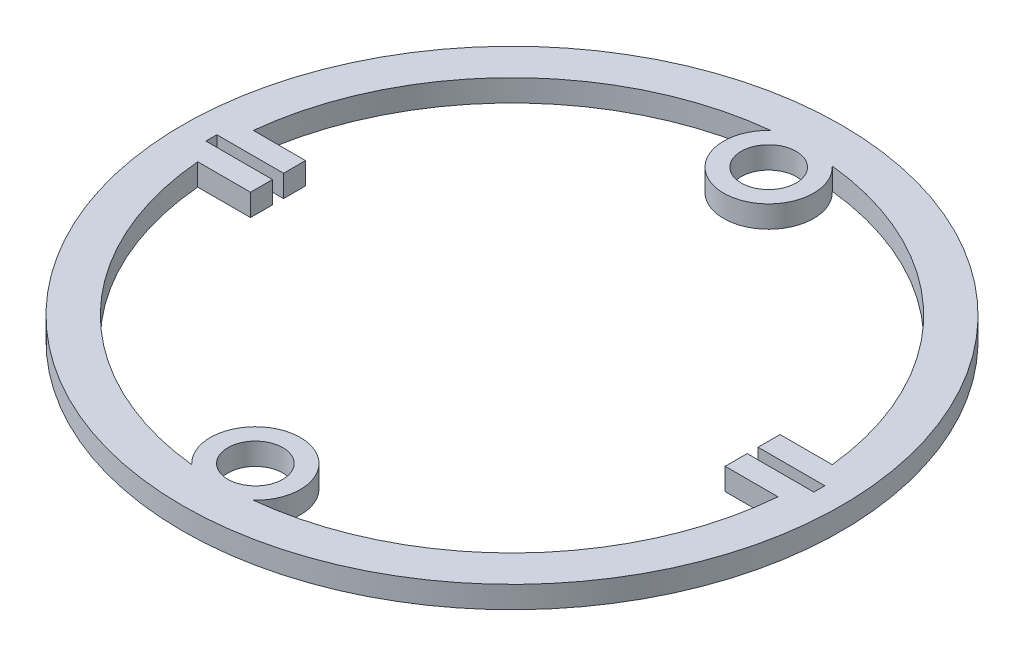
ISO-10303-21;
HEADER;
FILE_DESCRIPTION(('STEP AP214'),'2;1');
FILE_NAME('part.step','',(''),(''),'','','');
FILE_SCHEMA(('AUTOMOTIVE_DESIGN { 1 0 10303 214 1 1 1 1 }'));
ENDSEC;
DATA;
#1=APPLICATION_CONTEXT('core data for automotive mechanical design processes');
#2=APPLICATION_PROTOCOL_DEFINITION('international standard','automotive_design',2000,#1);
#3=PRODUCT_CONTEXT('',#1,'mechanical');
#4=PRODUCT('Part','Part','',(#3));
#5=PRODUCT_RELATED_PRODUCT_CATEGORY('part','',(#4));
#6=PRODUCT_DEFINITION_FORMATION('','',#4);
#7=PRODUCT_DEFINITION_CONTEXT('part definition',#1,'design');
#8=PRODUCT_DEFINITION('design','',#6,#7);
#9=PRODUCT_DEFINITION_SHAPE('','',#8);
#10=(LENGTH_UNIT() NAMED_UNIT(*) SI_UNIT(.MILLI.,.METRE.));
#11=(NAMED_UNIT(*) PLANE_ANGLE_UNIT() SI_UNIT($,.RADIAN.));
#12=(NAMED_UNIT(*) SI_UNIT($,.STERADIAN.) SOLID_ANGLE_UNIT());
#13=UNCERTAINTY_MEASURE_WITH_UNIT(LENGTH_MEASURE(1.E-05),#10,'distance_accuracy_value','');
#14=(GEOMETRIC_REPRESENTATION_CONTEXT(3) GLOBAL_UNCERTAINTY_ASSIGNED_CONTEXT((#13)) GLOBAL_UNIT_ASSIGNED_CONTEXT((#10,
#11,#12)) REPRESENTATION_CONTEXT('',''));
#15=CARTESIAN_POINT('',(0.,0.,0.));
#16=DIRECTION('',(0.,0.,1.));
#17=DIRECTION('',(1.,0.,0.));
#18=AXIS2_PLACEMENT_3D('',#15,#16,#17);
#19=CARTESIAN_POINT('',(0.,50.8,0.));
#20=DIRECTION('',(0.,-1.,0.));
#21=DIRECTION('',(0.,0.,-1.));
#22=AXIS2_PLACEMENT_3D('',#19,#20,#21);
#23=CYLINDRICAL_SURFACE('',#22,33.655);
#24=DIRECTION('',(0.,-1.,0.));
#25=VECTOR('',#24,1.);
#26=CARTESIAN_POINT('',(-33.5390282357704,50.8,2.79152467304071));
#27=LINE('',#26,#25);
#28=CARTESIAN_POINT('',(-33.5390282357704,2.54,2.79152467304071));
#29=VERTEX_POINT('',#28);
#30=CARTESIAN_POINT('',(-33.5390282357704,0.,2.79152467304071));
#31=VERTEX_POINT('',#30);
#32=EDGE_CURVE('E186',#29,#31,#27,.T.);
#33=ORIENTED_EDGE('',*,*,#32,.F.);
#34=CARTESIAN_POINT('',(0.,2.54,0.));
#35=DIRECTION('',(0.,1.,0.));
#36=DIRECTION('',(0.,0.,1.));
#37=AXIS2_PLACEMENT_3D('',#34,#35,#36);
#38=CIRCLE('',#37,33.655);
#39=CARTESIAN_POINT('',(-3.56514678961038,2.54,33.4656354096038));
#40=VERTEX_POINT('',#39);
#41=EDGE_CURVE('E176',#29,#40,#38,.T.);
#42=ORIENTED_EDGE('',*,*,#41,.T.);
#43=DIRECTION('',(0.,-1.,0.));
#44=VECTOR('',#43,1.);
#45=CARTESIAN_POINT('',(-3.56514678961037,50.8,33.4656354096039));
#46=LINE('',#45,#44);
#47=CARTESIAN_POINT('',(-3.56514678961039,0.,33.4656354096038));
#48=VERTEX_POINT('',#47);
#49=EDGE_CURVE('E184',#48,#40,#46,.F.);
#50=ORIENTED_EDGE('',*,*,#49,.F.);
#51=CARTESIAN_POINT('',(0.,0.,0.));
#52=DIRECTION('',(0.,1.,0.));
#53=DIRECTION('',(0.,0.,1.));
#54=AXIS2_PLACEMENT_3D('',#51,#52,#53);
#55=CIRCLE('',#54,33.655);
#56=EDGE_CURVE('E226',#31,#48,#55,.T.);
#57=ORIENTED_EDGE('',*,*,#56,.F.);
#58=EDGE_LOOP('',(#33,#42,#50,#57));
#59=FACE_BOUND('',#58,.T.);
#60=ADVANCED_FACE('F37',(#59),#23,.F.);
#61=CARTESIAN_POINT('',(0.,50.8,0.));
#62=DIRECTION('',(0.,-1.,0.));
#63=DIRECTION('',(0.,0.,-1.));
#64=AXIS2_PLACEMENT_3D('',#61,#62,#63);
#65=CYLINDRICAL_SURFACE('',#64,33.655);
#66=DIRECTION('',(0.,-1.,0.));
#67=VECTOR('',#66,1.);
#68=CARTESIAN_POINT('',(33.4663454584964,50.8,-3.55847532695926));
#69=LINE('',#68,#67);
#70=CARTESIAN_POINT('',(33.4663454584964,2.54,-3.55847532695926));
#71=VERTEX_POINT('',#70);
#72=CARTESIAN_POINT('',(33.4663454584964,0.,-3.55847532695926));
#73=VERTEX_POINT('',#72);
#74=EDGE_CURVE('E260',#71,#73,#69,.T.);
#75=ORIENTED_EDGE('',*,*,#74,.F.);
#76=CARTESIAN_POINT('',(0.,2.54,0.));
#77=DIRECTION('',(0.,1.,0.));
#78=DIRECTION('',(0.,0.,1.));
#79=AXIS2_PLACEMENT_3D('',#76,#77,#78);
#80=CIRCLE('',#79,33.655);
#81=CARTESIAN_POINT('',(3.56514678961039,2.54,-33.4656354096038));
#82=VERTEX_POINT('',#81);
#83=EDGE_CURVE('E320',#71,#82,#80,.T.);
#84=ORIENTED_EDGE('',*,*,#83,.T.);
#85=DIRECTION('',(0.,-1.,0.));
#86=VECTOR('',#85,1.);
#87=CARTESIAN_POINT('',(3.56514678961037,50.8,-33.4656354096039));
#88=LINE('',#87,#86);
#89=CARTESIAN_POINT('',(3.5651467896104,0.,-33.4656354096038));
#90=VERTEX_POINT('',#89);
#91=EDGE_CURVE('E204',#90,#82,#88,.F.);
#92=ORIENTED_EDGE('',*,*,#91,.F.);
#93=CARTESIAN_POINT('',(0.,0.,0.));
#94=DIRECTION('',(0.,1.,0.));
#95=DIRECTION('',(0.,0.,1.));
#96=AXIS2_PLACEMENT_3D('',#93,#94,#95);
#97=CIRCLE('',#96,33.655);
#98=EDGE_CURVE('E250',#73,#90,#97,.T.);
#99=ORIENTED_EDGE('',*,*,#98,.F.);
#100=EDGE_LOOP('',(#75,#84,#92,#99));
#101=FACE_BOUND('',#100,.T.);
#102=ADVANCED_FACE('F360',(#101),#65,.F.);
#103=CARTESIAN_POINT('',(0.,50.8,0.));
#104=DIRECTION('',(0.,-1.,0.));
#105=DIRECTION('',(0.,0.,-1.));
#106=AXIS2_PLACEMENT_3D('',#103,#104,#105);
#107=CYLINDRICAL_SURFACE('',#106,38.1);
#108=CARTESIAN_POINT('',(0.,0.,0.));
#109=DIRECTION('',(0.,1.,0.));
#110=DIRECTION('',(0.,0.,1.));
#111=AXIS2_PLACEMENT_3D('',#108,#109,#110);
#112=CIRCLE('',#111,38.1);
#113=CARTESIAN_POINT('',(0.,0.,38.1));
#114=VERTEX_POINT('',#113);
#115=EDGE_CURVE('E11',#114,#114,#112,.T.);
#116=ORIENTED_EDGE('',*,*,#115,.T.);
#117=EDGE_LOOP('',(#116));
#118=FACE_BOUND('',#117,.T.);
#119=CARTESIAN_POINT('',(0.,2.54,0.));
#120=DIRECTION('',(0.,1.,0.));
#121=DIRECTION('',(0.,0.,1.));
#122=AXIS2_PLACEMENT_3D('',#119,#120,#121);
#123=CIRCLE('',#122,38.1);
#124=CARTESIAN_POINT('',(0.,2.54,38.1));
#125=VERTEX_POINT('',#124);
#126=EDGE_CURVE('E463',#125,#125,#123,.T.);
#127=ORIENTED_EDGE('',*,*,#126,.F.);
#128=EDGE_LOOP('',(#127));
#129=FACE_BOUND('',#128,.T.);
#130=ADVANCED_FACE('F39',(#118,#129),#107,.T.);
#131=CARTESIAN_POINT('',(-27.428899680328,50.8,-1.01847532695926));
#132=DIRECTION('',(1.,0.,0.));
#133=DIRECTION('',(0.,0.,-1.));
#134=AXIS2_PLACEMENT_3D('',#131,#132,#133);
#135=PLANE('',#134);
#136=DIRECTION('',(0.,-1.,0.));
#137=VECTOR('',#136,1.);
#138=CARTESIAN_POINT('',(-27.428899680328,50.8,-3.55847532695926));
#139=LINE('',#138,#137);
#140=CARTESIAN_POINT('',(-27.428899680328,2.54,-3.55847532695926));
#141=VERTEX_POINT('',#140);
#142=CARTESIAN_POINT('',(-27.428899680328,0.,-3.55847532695926));
#143=VERTEX_POINT('',#142);
#144=EDGE_CURVE('E256',#141,#143,#139,.T.);
#145=ORIENTED_EDGE('',*,*,#144,.F.);
#146=DIRECTION('',(0.,0.,1.));
#147=VECTOR('',#146,1.);
#148=CARTESIAN_POINT('',(-27.428899680328,2.54,-1.01847532695926));
#149=LINE('',#148,#147);
#150=CARTESIAN_POINT('',(-27.428899680328,2.54,-1.01847532695926));
#151=VERTEX_POINT('',#150);
#152=EDGE_CURVE('E292',#141,#151,#149,.T.);
#153=ORIENTED_EDGE('',*,*,#152,.T.);
#154=DIRECTION('',(0.,-1.,0.));
#155=VECTOR('',#154,1.);
#156=CARTESIAN_POINT('',(-27.428899680328,50.8,-1.01847532695926));
#157=LINE('',#156,#155);
#158=CARTESIAN_POINT('',(-27.428899680328,0.,-1.01847532695926));
#159=VERTEX_POINT('',#158);
#160=EDGE_CURVE('E46',#151,#159,#157,.T.);
#161=ORIENTED_EDGE('',*,*,#160,.T.);
#162=DIRECTION('',(0.,0.,1.));
#163=VECTOR('',#162,1.);
#164=CARTESIAN_POINT('',(-27.428899680328,0.,-1.01847532695926));
#165=LINE('',#164,#163);
#166=EDGE_CURVE('E207',#143,#159,#165,.T.);
#167=ORIENTED_EDGE('',*,*,#166,.F.);
#168=EDGE_LOOP('',(#145,#153,#161,#167));
#169=FACE_BOUND('',#168,.T.);
#170=ADVANCED_FACE('F291',(#169),#135,.T.);
#171=CARTESIAN_POINT('',(-35.1439707138637,50.8,-1.01847532695926));
#172=DIRECTION('',(0.,0.,1.));
#173=DIRECTION('',(1.,0.,0.));
#174=AXIS2_PLACEMENT_3D('',#171,#172,#173);
#175=PLANE('',#174);
#176=ORIENTED_EDGE('',*,*,#160,.F.);
#177=DIRECTION('',(-1.,0.,0.));
#178=VECTOR('',#177,1.);
#179=CARTESIAN_POINT('',(-35.1439707138637,2.54,-1.01847532695926));
#180=LINE('',#179,#178);
#181=CARTESIAN_POINT('',(-35.1439707138637,2.54,-1.01847532695926));
#182=VERTEX_POINT('',#181);
#183=EDGE_CURVE('E316',#151,#182,#180,.T.);
#184=ORIENTED_EDGE('',*,*,#183,.T.);
#185=DIRECTION('',(0.,-1.,0.));
#186=VECTOR('',#185,1.);
#187=CARTESIAN_POINT('',(-35.1439707138637,50.8,-1.01847532695926));
#188=LINE('',#187,#186);
#189=CARTESIAN_POINT('',(-35.1439707138637,0.,-1.01847532695926));
#190=VERTEX_POINT('',#189);
#191=EDGE_CURVE('E283',#182,#190,#188,.T.);
#192=ORIENTED_EDGE('',*,*,#191,.T.);
#193=DIRECTION('',(-1.,0.,0.));
#194=VECTOR('',#193,1.);
#195=CARTESIAN_POINT('',(-35.1439707138637,0.,-1.01847532695926));
#196=LINE('',#195,#194);
#197=EDGE_CURVE('E210',#159,#190,#196,.T.);
#198=ORIENTED_EDGE('',*,*,#197,.F.);
#199=EDGE_LOOP('',(#176,#184,#192,#198));
#200=FACE_BOUND('',#199,.T.);
#201=ADVANCED_FACE('F295',(#200),#175,.T.);
#202=CARTESIAN_POINT('',(-35.1439707138637,50.8,-1.01847532695926));
#203=DIRECTION('',(1.,0.,0.));
#204=DIRECTION('',(0.,0.,-1.));
#205=AXIS2_PLACEMENT_3D('',#202,#203,#204);
#206=PLANE('',#205);
#207=ORIENTED_EDGE('',*,*,#191,.F.);
#208=DIRECTION('',(0.,0.,1.));
#209=VECTOR('',#208,1.);
#210=CARTESIAN_POINT('',(-35.1439707138637,2.54,-1.01847532695926));
#211=LINE('',#210,#209);
#212=CARTESIAN_POINT('',(-35.1439707138637,2.54,0.251524673040711));
#213=VERTEX_POINT('',#212);
#214=EDGE_CURVE('E429',#182,#213,#211,.T.);
#215=ORIENTED_EDGE('',*,*,#214,.T.);
#216=DIRECTION('',(0.,-1.,0.));
#217=VECTOR('',#216,1.);
#218=CARTESIAN_POINT('',(-35.1439707138637,50.8,0.251524673040711));
#219=LINE('',#218,#217);
#220=CARTESIAN_POINT('',(-35.1439707138637,0.,0.251524673040711));
#221=VERTEX_POINT('',#220);
#222=EDGE_CURVE('E281',#213,#221,#219,.T.);
#223=ORIENTED_EDGE('',*,*,#222,.T.);
#224=DIRECTION('',(0.,0.,1.));
#225=VECTOR('',#224,1.);
#226=CARTESIAN_POINT('',(-35.1439707138637,0.,-1.01847532695926));
#227=LINE('',#226,#225);
#228=EDGE_CURVE('E213',#190,#221,#227,.T.);
#229=ORIENTED_EDGE('',*,*,#228,.F.);
#230=EDGE_LOOP('',(#207,#215,#223,#229));
#231=FACE_BOUND('',#230,.T.);
#232=ADVANCED_FACE('F433',(#231),#206,.T.);
#233=CARTESIAN_POINT('',(-35.1439707138637,50.8,0.251524673040711));
#234=DIRECTION('',(0.,0.,-1.));
#235=DIRECTION('',(-1.,0.,0.));
#236=AXIS2_PLACEMENT_3D('',#233,#234,#235);
#237=PLANE('',#236);
#238=ORIENTED_EDGE('',*,*,#222,.F.);
#239=DIRECTION('',(1.,0.,0.));
#240=VECTOR('',#239,1.);
#241=CARTESIAN_POINT('',(-35.1439707138637,2.54,0.251524673040711));
#242=LINE('',#241,#240);
#243=CARTESIAN_POINT('',(-27.4370895420126,2.54,0.251524673040711));
#244=VERTEX_POINT('',#243);
#245=EDGE_CURVE('E426',#213,#244,#242,.T.);
#246=ORIENTED_EDGE('',*,*,#245,.T.);
#247=DIRECTION('',(0.,-1.,0.));
#248=VECTOR('',#247,1.);
#249=CARTESIAN_POINT('',(-27.4370895420126,50.8,0.251524673040711));
#250=LINE('',#249,#248);
#251=CARTESIAN_POINT('',(-27.4370895420126,0.,0.251524673040711));
#252=VERTEX_POINT('',#251);
#253=EDGE_CURVE('E279',#244,#252,#250,.T.);
#254=ORIENTED_EDGE('',*,*,#253,.T.);
#255=DIRECTION('',(1.,0.,0.));
#256=VECTOR('',#255,1.);
#257=CARTESIAN_POINT('',(-35.1439707138637,0.,0.251524673040711));
#258=LINE('',#257,#256);
#259=EDGE_CURVE('E216',#221,#252,#258,.T.);
#260=ORIENTED_EDGE('',*,*,#259,.F.);
#261=EDGE_LOOP('',(#238,#246,#254,#260));
#262=FACE_BOUND('',#261,.T.);
#263=ADVANCED_FACE('F438',(#262),#237,.T.);
#264=CARTESIAN_POINT('',(-27.4370895420126,50.8,0.251524673040711));
#265=DIRECTION('',(1.,0.,0.));
#266=DIRECTION('',(0.,0.,-1.));
#267=AXIS2_PLACEMENT_3D('',#264,#265,#266);
#268=PLANE('',#267);
#269=ORIENTED_EDGE('',*,*,#253,.F.);
#270=DIRECTION('',(0.,0.,1.));
#271=VECTOR('',#270,1.);
#272=CARTESIAN_POINT('',(-27.4370895420126,2.54,0.251524673040711));
#273=LINE('',#272,#271);
#274=CARTESIAN_POINT('',(-27.4370895420126,2.54,2.79152467304071));
#275=VERTEX_POINT('',#274);
#276=EDGE_CURVE('E420',#244,#275,#273,.T.);
#277=ORIENTED_EDGE('',*,*,#276,.T.);
#278=DIRECTION('',(0.,-1.,0.));
#279=VECTOR('',#278,1.);
#280=CARTESIAN_POINT('',(-27.4370895420126,50.8,2.79152467304071));
#281=LINE('',#280,#279);
#282=CARTESIAN_POINT('',(-27.4370895420126,0.,2.79152467304071));
#283=VERTEX_POINT('',#282);
#284=EDGE_CURVE('E277',#275,#283,#281,.T.);
#285=ORIENTED_EDGE('',*,*,#284,.T.);
#286=DIRECTION('',(0.,0.,1.));
#287=VECTOR('',#286,1.);
#288=CARTESIAN_POINT('',(-27.4370895420126,0.,0.251524673040711));
#289=LINE('',#288,#287);
#290=EDGE_CURVE('E219',#252,#283,#289,.T.);
#291=ORIENTED_EDGE('',*,*,#290,.F.);
#292=EDGE_LOOP('',(#269,#277,#285,#291));
#293=FACE_BOUND('',#292,.T.);
#294=ADVANCED_FACE('F380',(#293),#268,.T.);
#295=CARTESIAN_POINT('',(-27.4370895420126,50.8,2.79152467304071));
#296=DIRECTION('',(0.,0.,1.));
#297=DIRECTION('',(1.,0.,0.));
#298=AXIS2_PLACEMENT_3D('',#295,#296,#297);
#299=PLANE('',#298);
#300=ORIENTED_EDGE('',*,*,#284,.F.);
#301=DIRECTION('',(-1.,0.,0.));
#302=VECTOR('',#301,1.);
#303=CARTESIAN_POINT('',(-27.4370895420126,2.54,2.79152467304071));
#304=LINE('',#303,#302);
#305=EDGE_CURVE('E418',#275,#29,#304,.T.);
#306=ORIENTED_EDGE('',*,*,#305,.T.);
#307=ORIENTED_EDGE('',*,*,#32,.T.);
#308=DIRECTION('',(-1.,0.,0.));
#309=VECTOR('',#308,1.);
#310=CARTESIAN_POINT('',(-27.4370895420126,0.,2.79152467304071));
#311=LINE('',#310,#309);
#312=EDGE_CURVE('E222',#283,#31,#311,.T.);
#313=ORIENTED_EDGE('',*,*,#312,.F.);
#314=EDGE_LOOP('',(#300,#306,#307,#313));
#315=FACE_BOUND('',#314,.T.);
#316=ADVANCED_FACE('F372',(#315),#299,.T.);
#317=DIRECTION('',(0.,-1.,0.));
#318=VECTOR('',#317,1.);
#319=CARTESIAN_POINT('',(3.56514678961037,50.8,33.4656354096039));
#320=LINE('',#319,#318);
#321=CARTESIAN_POINT('',(3.56514678961037,2.54,33.4656354096039));
#322=VERTEX_POINT('',#321);
#323=CARTESIAN_POINT('',(3.56514678961039,0.,33.4656354096038));
#324=VERTEX_POINT('',#323);
#325=EDGE_CURVE('E60',#322,#324,#320,.T.);
#326=ORIENTED_EDGE('',*,*,#325,.F.);
#327=CARTESIAN_POINT('',(0.,2.54,0.));
#328=DIRECTION('',(0.,1.,0.));
#329=DIRECTION('',(0.,0.,1.));
#330=AXIS2_PLACEMENT_3D('',#327,#328,#329);
#331=CIRCLE('',#330,33.655);
#332=CARTESIAN_POINT('',(33.5390282357704,2.54,2.79152467304071));
#333=VERTEX_POINT('',#332);
#334=EDGE_CURVE('E53',#322,#333,#331,.T.);
#335=ORIENTED_EDGE('',*,*,#334,.T.);
#336=DIRECTION('',(0.,-1.,0.));
#337=VECTOR('',#336,1.);
#338=CARTESIAN_POINT('',(33.5390282357704,50.8,2.79152467304071));
#339=LINE('',#338,#337);
#340=CARTESIAN_POINT('',(33.5390282357704,0.,2.79152467304071));
#341=VERTEX_POINT('',#340);
#342=EDGE_CURVE('E274',#333,#341,#339,.T.);
#343=ORIENTED_EDGE('',*,*,#342,.T.);
#344=EDGE_CURVE('E225',#324,#341,#55,.T.);
#345=ORIENTED_EDGE('',*,*,#344,.F.);
#346=EDGE_LOOP('',(#326,#335,#343,#345));
#347=FACE_BOUND('',#346,.T.);
#348=ADVANCED_FACE('F362',(#347),#23,.F.);
#349=CARTESIAN_POINT('',(27.4370895420126,50.8,2.79152467304071));
#350=DIRECTION('',(0.,0.,1.));
#351=DIRECTION('',(1.,0.,0.));
#352=AXIS2_PLACEMENT_3D('',#349,#350,#351);
#353=PLANE('',#352);
#354=ORIENTED_EDGE('',*,*,#342,.F.);
#355=DIRECTION('',(-1.,0.,0.));
#356=VECTOR('',#355,1.);
#357=CARTESIAN_POINT('',(27.4370895420126,2.54,2.79152467304071));
#358=LINE('',#357,#356);
#359=CARTESIAN_POINT('',(27.4370895420126,2.54,2.79152467304071));
#360=VERTEX_POINT('',#359);
#361=EDGE_CURVE('E187',#333,#360,#358,.T.);
#362=ORIENTED_EDGE('',*,*,#361,.T.);
#363=DIRECTION('',(0.,-1.,0.));
#364=VECTOR('',#363,1.);
#365=CARTESIAN_POINT('',(27.4370895420126,50.8,2.79152467304071));
#366=LINE('',#365,#364);
#367=CARTESIAN_POINT('',(27.4370895420126,0.,2.79152467304071));
#368=VERTEX_POINT('',#367);
#369=EDGE_CURVE('E272',#360,#368,#366,.T.);
#370=ORIENTED_EDGE('',*,*,#369,.T.);
#371=DIRECTION('',(-1.,0.,0.));
#372=VECTOR('',#371,1.);
#373=CARTESIAN_POINT('',(27.4370895420126,0.,2.79152467304071));
#374=LINE('',#373,#372);
#375=EDGE_CURVE('E228',#341,#368,#374,.T.);
#376=ORIENTED_EDGE('',*,*,#375,.F.);
#377=EDGE_LOOP('',(#354,#362,#370,#376));
#378=FACE_BOUND('',#377,.T.);
#379=ADVANCED_FACE('F371',(#378),#353,.T.);
#380=CARTESIAN_POINT('',(27.4370895420126,50.8,0.251524673040711));
#381=DIRECTION('',(-1.,0.,0.));
#382=DIRECTION('',(0.,0.,1.));
#383=AXIS2_PLACEMENT_3D('',#380,#381,#382);
#384=PLANE('',#383);
#385=ORIENTED_EDGE('',*,*,#369,.F.);
#386=DIRECTION('',(0.,0.,-1.));
#387=VECTOR('',#386,1.);
#388=CARTESIAN_POINT('',(27.4370895420126,2.54,0.251524673040711));
#389=LINE('',#388,#387);
#390=CARTESIAN_POINT('',(27.4370895420126,2.54,0.251524673040711));
#391=VERTEX_POINT('',#390);
#392=EDGE_CURVE('E310',#360,#391,#389,.T.);
#393=ORIENTED_EDGE('',*,*,#392,.T.);
#394=DIRECTION('',(0.,-1.,0.));
#395=VECTOR('',#394,1.);
#396=CARTESIAN_POINT('',(27.4370895420126,50.8,0.251524673040711));
#397=LINE('',#396,#395);
#398=CARTESIAN_POINT('',(27.4370895420126,0.,0.251524673040711));
#399=VERTEX_POINT('',#398);
#400=EDGE_CURVE('E270',#391,#399,#397,.T.);
#401=ORIENTED_EDGE('',*,*,#400,.T.);
#402=DIRECTION('',(0.,0.,-1.));
#403=VECTOR('',#402,1.);
#404=CARTESIAN_POINT('',(27.4370895420126,0.,0.251524673040711));
#405=LINE('',#404,#403);
#406=EDGE_CURVE('E231',#368,#399,#405,.T.);
#407=ORIENTED_EDGE('',*,*,#406,.F.);
#408=EDGE_LOOP('',(#385,#393,#401,#407));
#409=FACE_BOUND('',#408,.T.);
#410=ADVANCED_FACE('F378',(#409),#384,.T.);
#411=CARTESIAN_POINT('',(35.1439707138637,50.8,0.251524673040711));
#412=DIRECTION('',(0.,0.,-1.));
#413=DIRECTION('',(-1.,0.,0.));
#414=AXIS2_PLACEMENT_3D('',#411,#412,#413);
#415=PLANE('',#414);
#416=ORIENTED_EDGE('',*,*,#400,.F.);
#417=DIRECTION('',(1.,0.,0.));
#418=VECTOR('',#417,1.);
#419=CARTESIAN_POINT('',(35.1439707138637,2.54,0.251524673040711));
#420=LINE('',#419,#418);
#421=CARTESIAN_POINT('',(35.1439707138637,2.54,0.251524673040711));
#422=VERTEX_POINT('',#421);
#423=EDGE_CURVE('E397',#391,#422,#420,.T.);
#424=ORIENTED_EDGE('',*,*,#423,.T.);
#425=DIRECTION('',(0.,-1.,0.));
#426=VECTOR('',#425,1.);
#427=CARTESIAN_POINT('',(35.1439707138637,50.8,0.251524673040711));
#428=LINE('',#427,#426);
#429=CARTESIAN_POINT('',(35.1439707138637,0.,0.251524673040711));
#430=VERTEX_POINT('',#429);
#431=EDGE_CURVE('E268',#422,#430,#428,.T.);
#432=ORIENTED_EDGE('',*,*,#431,.T.);
#433=DIRECTION('',(1.,0.,0.));
#434=VECTOR('',#433,1.);
#435=CARTESIAN_POINT('',(35.1439707138637,0.,0.251524673040711));
#436=LINE('',#435,#434);
#437=EDGE_CURVE('E234',#399,#430,#436,.T.);
#438=ORIENTED_EDGE('',*,*,#437,.F.);
#439=EDGE_LOOP('',(#416,#424,#432,#438));
#440=FACE_BOUND('',#439,.T.);
#441=ADVANCED_FACE('F394',(#440),#415,.T.);
#442=CARTESIAN_POINT('',(35.1439707138637,50.8,-1.01847532695926));
#443=DIRECTION('',(-1.,0.,0.));
#444=DIRECTION('',(0.,0.,1.));
#445=AXIS2_PLACEMENT_3D('',#442,#443,#444);
#446=PLANE('',#445);
#447=ORIENTED_EDGE('',*,*,#431,.F.);
#448=DIRECTION('',(0.,0.,-1.));
#449=VECTOR('',#448,1.);
#450=CARTESIAN_POINT('',(35.1439707138637,2.54,-1.01847532695926));
#451=LINE('',#450,#449);
#452=CARTESIAN_POINT('',(35.1439707138637,2.54,-1.01847532695926));
#453=VERTEX_POINT('',#452);
#454=EDGE_CURVE('E328',#422,#453,#451,.T.);
#455=ORIENTED_EDGE('',*,*,#454,.T.);
#456=DIRECTION('',(0.,-1.,0.));
#457=VECTOR('',#456,1.);
#458=CARTESIAN_POINT('',(35.1439707138637,50.8,-1.01847532695926));
#459=LINE('',#458,#457);
#460=CARTESIAN_POINT('',(35.1439707138637,0.,-1.01847532695926));
#461=VERTEX_POINT('',#460);
#462=EDGE_CURVE('E266',#453,#461,#459,.T.);
#463=ORIENTED_EDGE('',*,*,#462,.T.);
#464=DIRECTION('',(0.,0.,-1.));
#465=VECTOR('',#464,1.);
#466=CARTESIAN_POINT('',(35.1439707138637,0.,-1.01847532695926));
#467=LINE('',#466,#465);
#468=EDGE_CURVE('E237',#430,#461,#467,.T.);
#469=ORIENTED_EDGE('',*,*,#468,.F.);
#470=EDGE_LOOP('',(#447,#455,#463,#469));
#471=FACE_BOUND('',#470,.T.);
#472=ADVANCED_FACE('F399',(#471),#446,.T.);
#473=CARTESIAN_POINT('',(35.1439707138637,50.8,-1.01847532695926));
#474=DIRECTION('',(0.,0.,1.));
#475=DIRECTION('',(1.,0.,0.));
#476=AXIS2_PLACEMENT_3D('',#473,#474,#475);
#477=PLANE('',#476);
#478=ORIENTED_EDGE('',*,*,#462,.F.);
#479=DIRECTION('',(-1.,0.,0.));
#480=VECTOR('',#479,1.);
#481=CARTESIAN_POINT('',(35.1439707138637,2.54,-1.01847532695926));
#482=LINE('',#481,#480);
#483=CARTESIAN_POINT('',(27.428899680328,2.54,-1.01847532695926));
#484=VERTEX_POINT('',#483);
#485=EDGE_CURVE('E325',#453,#484,#482,.T.);
#486=ORIENTED_EDGE('',*,*,#485,.T.);
#487=DIRECTION('',(0.,-1.,0.));
#488=VECTOR('',#487,1.);
#489=CARTESIAN_POINT('',(27.428899680328,50.8,-1.01847532695926));
#490=LINE('',#489,#488);
#491=CARTESIAN_POINT('',(27.428899680328,0.,-1.01847532695926));
#492=VERTEX_POINT('',#491);
#493=EDGE_CURVE('E264',#484,#492,#490,.T.);
#494=ORIENTED_EDGE('',*,*,#493,.T.);
#495=DIRECTION('',(-1.,0.,0.));
#496=VECTOR('',#495,1.);
#497=CARTESIAN_POINT('',(35.1439707138637,0.,-1.01847532695926));
#498=LINE('',#497,#496);
#499=EDGE_CURVE('E240',#461,#492,#498,.T.);
#500=ORIENTED_EDGE('',*,*,#499,.F.);
#501=EDGE_LOOP('',(#478,#486,#494,#500));
#502=FACE_BOUND('',#501,.T.);
#503=ADVANCED_FACE('F403',(#502),#477,.T.);
#504=CARTESIAN_POINT('',(27.428899680328,50.8,-1.01847532695926));
#505=DIRECTION('',(-1.,0.,0.));
#506=DIRECTION('',(0.,0.,1.));
#507=AXIS2_PLACEMENT_3D('',#504,#505,#506);
#508=PLANE('',#507);
#509=ORIENTED_EDGE('',*,*,#493,.F.);
#510=DIRECTION('',(0.,0.,-1.));
#511=VECTOR('',#510,1.);
#512=CARTESIAN_POINT('',(27.428899680328,2.54,-1.01847532695926));
#513=LINE('',#512,#511);
#514=CARTESIAN_POINT('',(27.428899680328,2.54,-3.55847532695926));
#515=VERTEX_POINT('',#514);
#516=EDGE_CURVE('E319',#484,#515,#513,.T.);
#517=ORIENTED_EDGE('',*,*,#516,.T.);
#518=DIRECTION('',(0.,-1.,0.));
#519=VECTOR('',#518,1.);
#520=CARTESIAN_POINT('',(27.428899680328,50.8,-3.55847532695926));
#521=LINE('',#520,#519);
#522=CARTESIAN_POINT('',(27.428899680328,0.,-3.55847532695926));
#523=VERTEX_POINT('',#522);
#524=EDGE_CURVE('E262',#515,#523,#521,.T.);
#525=ORIENTED_EDGE('',*,*,#524,.T.);
#526=DIRECTION('',(0.,0.,-1.));
#527=VECTOR('',#526,1.);
#528=CARTESIAN_POINT('',(27.428899680328,0.,-1.01847532695926));
#529=LINE('',#528,#527);
#530=EDGE_CURVE('E243',#492,#523,#529,.T.);
#531=ORIENTED_EDGE('',*,*,#530,.F.);
#532=EDGE_LOOP('',(#509,#517,#525,#531));
#533=FACE_BOUND('',#532,.T.);
#534=ADVANCED_FACE('F408',(#533),#508,.T.);
#535=CARTESIAN_POINT('',(27.428899680328,50.8,-3.55847532695926));
#536=DIRECTION('',(0.,0.,-1.));
#537=DIRECTION('',(-1.,0.,0.));
#538=AXIS2_PLACEMENT_3D('',#535,#536,#537);
#539=PLANE('',#538);
#540=DIRECTION('',(0.,-1.,0.));
#541=VECTOR('',#540,1.);
#542=CARTESIAN_POINT('',(-33.4663454584964,50.8,-3.55847532695926));
#543=LINE('',#542,#541);
#544=CARTESIAN_POINT('',(-33.4663454584964,2.54,-3.55847532695927));
#545=VERTEX_POINT('',#544);
#546=CARTESIAN_POINT('',(-33.4663454584964,0.,-3.55847532695926));
#547=VERTEX_POINT('',#546);
#548=EDGE_CURVE('E258',#545,#547,#543,.T.);
#549=ORIENTED_EDGE('',*,*,#548,.F.);
#550=DIRECTION('',(1.,0.,0.));
#551=VECTOR('',#550,1.);
#552=CARTESIAN_POINT('',(27.428899680328,2.54,-3.55847532695926));
#553=LINE('',#552,#551);
#554=EDGE_CURVE('E308',#545,#141,#553,.T.);
#555=ORIENTED_EDGE('',*,*,#554,.T.);
#556=ORIENTED_EDGE('',*,*,#144,.T.);
#557=DIRECTION('',(1.,0.,0.));
#558=VECTOR('',#557,1.);
#559=CARTESIAN_POINT('',(-27.428899680328,0.,-3.55847532695926));
#560=LINE('',#559,#558);
#561=EDGE_CURVE('E253',#547,#143,#560,.T.);
#562=ORIENTED_EDGE('',*,*,#561,.F.);
#563=EDGE_LOOP('',(#549,#555,#556,#562));
#564=FACE_BOUND('',#563,.T.);
#565=ADVANCED_FACE('F306',(#564),#539,.T.);
#566=ORIENTED_EDGE('',*,*,#524,.F.);
#567=EDGE_CURVE('E312',#515,#71,#553,.T.);
#568=ORIENTED_EDGE('',*,*,#567,.T.);
#569=ORIENTED_EDGE('',*,*,#74,.T.);
#570=DIRECTION('',(1.,0.,0.));
#571=VECTOR('',#570,1.);
#572=CARTESIAN_POINT('',(27.428899680328,0.,-3.55847532695926));
#573=LINE('',#572,#571);
#574=EDGE_CURVE('E246',#523,#73,#573,.T.);
#575=ORIENTED_EDGE('',*,*,#574,.F.);
#576=EDGE_LOOP('',(#566,#568,#569,#575));
#577=FACE_BOUND('',#576,.T.);
#578=ADVANCED_FACE('F409',(#577),#539,.T.);
#579=DIRECTION('',(0.,-1.,0.));
#580=VECTOR('',#579,1.);
#581=CARTESIAN_POINT('',(-3.56514678961037,50.8,-33.4656354096039));
#582=LINE('',#581,#580);
#583=CARTESIAN_POINT('',(-3.56514678961038,2.54,-33.4656354096038));
#584=VERTEX_POINT('',#583);
#585=CARTESIAN_POINT('',(-3.5651467896104,0.,-33.4656354096038));
#586=VERTEX_POINT('',#585);
#587=EDGE_CURVE('E202',#584,#586,#582,.T.);
#588=ORIENTED_EDGE('',*,*,#587,.F.);
#589=CARTESIAN_POINT('',(0.,2.54,0.));
#590=DIRECTION('',(0.,1.,0.));
#591=DIRECTION('',(0.,0.,1.));
#592=AXIS2_PLACEMENT_3D('',#589,#590,#591);
#593=CIRCLE('',#592,33.655);
#594=EDGE_CURVE('E314',#584,#545,#593,.T.);
#595=ORIENTED_EDGE('',*,*,#594,.T.);
#596=ORIENTED_EDGE('',*,*,#548,.T.);
#597=EDGE_CURVE('E249',#586,#547,#97,.T.);
#598=ORIENTED_EDGE('',*,*,#597,.F.);
#599=EDGE_LOOP('',(#588,#595,#596,#598));
#600=FACE_BOUND('',#599,.T.);
#601=ADVANCED_FACE('F367',(#600),#65,.F.);
#602=CARTESIAN_POINT('',(0.,101.6,-29.6705626344741));
#603=DIRECTION('',(0.,-1.,0.));
#604=DIRECTION('',(0.,0.,-1.));
#605=AXIS2_PLACEMENT_3D('',#602,#603,#604);
#606=CYLINDRICAL_SURFACE('',#605,5.207);
#607=ORIENTED_EDGE('',*,*,#91,.T.);
#608=CARTESIAN_POINT('',(0.,2.54,-29.6705626344741));
#609=DIRECTION('',(0.,1.,0.));
#610=DIRECTION('',(0.,0.,1.));
#611=AXIS2_PLACEMENT_3D('',#608,#609,#610);
#612=CIRCLE('',#611,5.207);
#613=EDGE_CURVE('E333',#82,#584,#612,.F.);
#614=ORIENTED_EDGE('',*,*,#613,.T.);
#615=ORIENTED_EDGE('',*,*,#587,.T.);
#616=CARTESIAN_POINT('',(0.,0.,-29.6705626344741));
#617=DIRECTION('',(0.,-1.,0.));
#618=DIRECTION('',(0.,0.,-1.));
#619=AXIS2_PLACEMENT_3D('',#616,#617,#618);
#620=CIRCLE('',#619,5.207);
#621=EDGE_CURVE('E194',#90,#586,#620,.T.);
#622=ORIENTED_EDGE('',*,*,#621,.F.);
#623=EDGE_LOOP('',(#607,#614,#615,#622));
#624=FACE_BOUND('',#623,.T.);
#625=ADVANCED_FACE('F417',(#624),#606,.T.);
#626=CARTESIAN_POINT('',(0.,101.6,-29.6705626344741));
#627=DIRECTION('',(0.,-1.,0.));
#628=DIRECTION('',(0.,0.,-1.));
#629=AXIS2_PLACEMENT_3D('',#626,#627,#628);
#630=CYLINDRICAL_SURFACE('',#629,3.175);
#631=CARTESIAN_POINT('',(0.,0.,-29.6705626344741));
#632=DIRECTION('',(0.,-1.,0.));
#633=DIRECTION('',(0.,0.,-1.));
#634=AXIS2_PLACEMENT_3D('',#631,#632,#633);
#635=CIRCLE('',#634,3.175);
#636=CARTESIAN_POINT('',(0.,0.,-32.8455626344741));
#637=VERTEX_POINT('',#636);
#638=EDGE_CURVE('E191',#637,#637,#635,.T.);
#639=ORIENTED_EDGE('',*,*,#638,.T.);
#640=EDGE_LOOP('',(#639));
#641=FACE_BOUND('',#640,.T.);
#642=CARTESIAN_POINT('',(0.,2.54,-29.6705626344741));
#643=DIRECTION('',(0.,1.,0.));
#644=DIRECTION('',(0.,0.,1.));
#645=AXIS2_PLACEMENT_3D('',#642,#643,#644);
#646=CIRCLE('',#645,3.175);
#647=CARTESIAN_POINT('',(0.,2.54,-26.4955626344741));
#648=VERTEX_POINT('',#647);
#649=EDGE_CURVE('E339',#648,#648,#646,.F.);
#650=ORIENTED_EDGE('',*,*,#649,.F.);
#651=EDGE_LOOP('',(#650));
#652=FACE_BOUND('',#651,.T.);
#653=ADVANCED_FACE('F471',(#641,#652),#630,.F.);
#654=CARTESIAN_POINT('',(0.,101.6,29.6705626344741));
#655=DIRECTION('',(0.,-1.,0.));
#656=DIRECTION('',(0.,0.,-1.));
#657=AXIS2_PLACEMENT_3D('',#654,#655,#656);
#658=CYLINDRICAL_SURFACE('',#657,5.207);
#659=ORIENTED_EDGE('',*,*,#49,.T.);
#660=CARTESIAN_POINT('',(0.,2.54,29.6705626344741));
#661=DIRECTION('',(0.,1.,0.));
#662=DIRECTION('',(0.,0.,1.));
#663=AXIS2_PLACEMENT_3D('',#660,#661,#662);
#664=CIRCLE('',#663,5.207);
#665=EDGE_CURVE('E172',#40,#322,#664,.F.);
#666=ORIENTED_EDGE('',*,*,#665,.T.);
#667=ORIENTED_EDGE('',*,*,#325,.T.);
#668=CARTESIAN_POINT('',(0.,0.,29.6705626344741));
#669=DIRECTION('',(0.,-1.,0.));
#670=DIRECTION('',(0.,0.,1.));
#671=AXIS2_PLACEMENT_3D('',#668,#669,#670);
#672=CIRCLE('',#671,5.207);
#673=EDGE_CURVE('E190',#48,#324,#672,.T.);
#674=ORIENTED_EDGE('',*,*,#673,.F.);
#675=EDGE_LOOP('',(#659,#666,#667,#674));
#676=FACE_BOUND('',#675,.T.);
#677=ADVANCED_FACE('F189',(#676),#658,.T.);
#678=CARTESIAN_POINT('',(0.,101.6,29.6705626344741));
#679=DIRECTION('',(0.,-1.,0.));
#680=DIRECTION('',(0.,0.,-1.));
#681=AXIS2_PLACEMENT_3D('',#678,#679,#680);
#682=CYLINDRICAL_SURFACE('',#681,3.175);
#683=CARTESIAN_POINT('',(0.,0.,29.6705626344741));
#684=DIRECTION('',(0.,-1.,0.));
#685=DIRECTION('',(0.,0.,1.));
#686=AXIS2_PLACEMENT_3D('',#683,#684,#685);
#687=CIRCLE('',#686,3.175);
#688=CARTESIAN_POINT('',(0.,0.,32.8455626344741));
#689=VERTEX_POINT('',#688);
#690=EDGE_CURVE('E196',#689,#689,#687,.T.);
#691=ORIENTED_EDGE('',*,*,#690,.T.);
#692=EDGE_LOOP('',(#691));
#693=FACE_BOUND('',#692,.T.);
#694=CARTESIAN_POINT('',(0.,2.54,29.6705626344741));
#695=DIRECTION('',(0.,1.,0.));
#696=DIRECTION('',(0.,0.,1.));
#697=AXIS2_PLACEMENT_3D('',#694,#695,#696);
#698=CIRCLE('',#697,3.175);
#699=CARTESIAN_POINT('',(0.,2.54,32.8455626344741));
#700=VERTEX_POINT('',#699);
#701=EDGE_CURVE('E41',#700,#700,#698,.F.);
#702=ORIENTED_EDGE('',*,*,#701,.F.);
#703=EDGE_LOOP('',(#702));
#704=FACE_BOUND('',#703,.T.);
#705=ADVANCED_FACE('F345',(#693,#704),#682,.F.);
#706=CARTESIAN_POINT('',(0.,0.,0.));
#707=DIRECTION('',(0.,1.,0.));
#708=DIRECTION('',(0.,0.,1.));
#709=AXIS2_PLACEMENT_3D('',#706,#707,#708);
#710=PLANE('',#709);
#711=ORIENTED_EDGE('',*,*,#115,.F.);
#712=EDGE_LOOP('',(#711));
#713=FACE_BOUND('',#712,.T.);
#714=ORIENTED_EDGE('',*,*,#56,.T.);
#715=ORIENTED_EDGE('',*,*,#673,.T.);
#716=ORIENTED_EDGE('',*,*,#344,.T.);
#717=ORIENTED_EDGE('',*,*,#375,.T.);
#718=ORIENTED_EDGE('',*,*,#406,.T.);
#719=ORIENTED_EDGE('',*,*,#437,.T.);
#720=ORIENTED_EDGE('',*,*,#468,.T.);
#721=ORIENTED_EDGE('',*,*,#499,.T.);
#722=ORIENTED_EDGE('',*,*,#530,.T.);
#723=ORIENTED_EDGE('',*,*,#574,.T.);
#724=ORIENTED_EDGE('',*,*,#98,.T.);
#725=ORIENTED_EDGE('',*,*,#621,.T.);
#726=ORIENTED_EDGE('',*,*,#597,.T.);
#727=ORIENTED_EDGE('',*,*,#561,.T.);
#728=ORIENTED_EDGE('',*,*,#166,.T.);
#729=ORIENTED_EDGE('',*,*,#197,.T.);
#730=ORIENTED_EDGE('',*,*,#228,.T.);
#731=ORIENTED_EDGE('',*,*,#259,.T.);
#732=ORIENTED_EDGE('',*,*,#290,.T.);
#733=ORIENTED_EDGE('',*,*,#312,.T.);
#734=EDGE_LOOP('',(#714,#715,#716,#717,#718,#719,#720,#721,#722,#723,#724,#725,#726,#727,#728,
#729,#730,#731,#732,#733));
#735=FACE_BOUND('',#734,.T.);
#736=ORIENTED_EDGE('',*,*,#638,.F.);
#737=EDGE_LOOP('',(#736));
#738=FACE_BOUND('',#737,.T.);
#739=ORIENTED_EDGE('',*,*,#690,.F.);
#740=EDGE_LOOP('',(#739));
#741=FACE_BOUND('',#740,.T.);
#742=ADVANCED_FACE('F299',(#713,#735,#738,#741),#710,.F.);
#743=CARTESIAN_POINT('',(0.,2.54,0.));
#744=DIRECTION('',(0.,1.,0.));
#745=DIRECTION('',(0.,0.,1.));
#746=AXIS2_PLACEMENT_3D('',#743,#744,#745);
#747=PLANE('',#746);
#748=ORIENTED_EDGE('',*,*,#454,.F.);
#749=ORIENTED_EDGE('',*,*,#423,.F.);
#750=ORIENTED_EDGE('',*,*,#392,.F.);
#751=ORIENTED_EDGE('',*,*,#361,.F.);
#752=ORIENTED_EDGE('',*,*,#334,.F.);
#753=ORIENTED_EDGE('',*,*,#665,.F.);
#754=ORIENTED_EDGE('',*,*,#41,.F.);
#755=ORIENTED_EDGE('',*,*,#305,.F.);
#756=ORIENTED_EDGE('',*,*,#276,.F.);
#757=ORIENTED_EDGE('',*,*,#245,.F.);
#758=ORIENTED_EDGE('',*,*,#214,.F.);
#759=ORIENTED_EDGE('',*,*,#183,.F.);
#760=ORIENTED_EDGE('',*,*,#152,.F.);
#761=ORIENTED_EDGE('',*,*,#554,.F.);
#762=ORIENTED_EDGE('',*,*,#594,.F.);
#763=ORIENTED_EDGE('',*,*,#613,.F.);
#764=ORIENTED_EDGE('',*,*,#83,.F.);
#765=ORIENTED_EDGE('',*,*,#567,.F.);
#766=ORIENTED_EDGE('',*,*,#516,.F.);
#767=ORIENTED_EDGE('',*,*,#485,.F.);
#768=EDGE_LOOP('',(#748,#749,#750,#751,#752,#753,#754,#755,#756,#757,#758,#759,#760,#761,#762,
#763,#764,#765,#766,#767));
#769=FACE_BOUND('',#768,.T.);
#770=ORIENTED_EDGE('',*,*,#126,.T.);
#771=EDGE_LOOP('',(#770));
#772=FACE_BOUND('',#771,.T.);
#773=ORIENTED_EDGE('',*,*,#701,.T.);
#774=EDGE_LOOP('',(#773));
#775=FACE_BOUND('',#774,.T.);
#776=ORIENTED_EDGE('',*,*,#649,.T.);
#777=EDGE_LOOP('',(#776));
#778=FACE_BOUND('',#777,.T.);
#779=ADVANCED_FACE('F174',(#769,#772,#775,#778),#747,.T.);
#780=CLOSED_SHELL('',(#60,#102,#130,#170,#201,#232,#263,#294,#316,#348,#379,#410,#441,#472,#503,
#534,#565,#578,#601,#625,#653,#677,#705,#742,#779));
#781=MANIFOLD_SOLID_BREP('B2',#780);
#782=ADVANCED_BREP_SHAPE_REPRESENTATION('',(#18,#781),#14);
#783=SHAPE_DEFINITION_REPRESENTATION(#9,#782);
ENDSEC;
END-ISO-10303-21;
